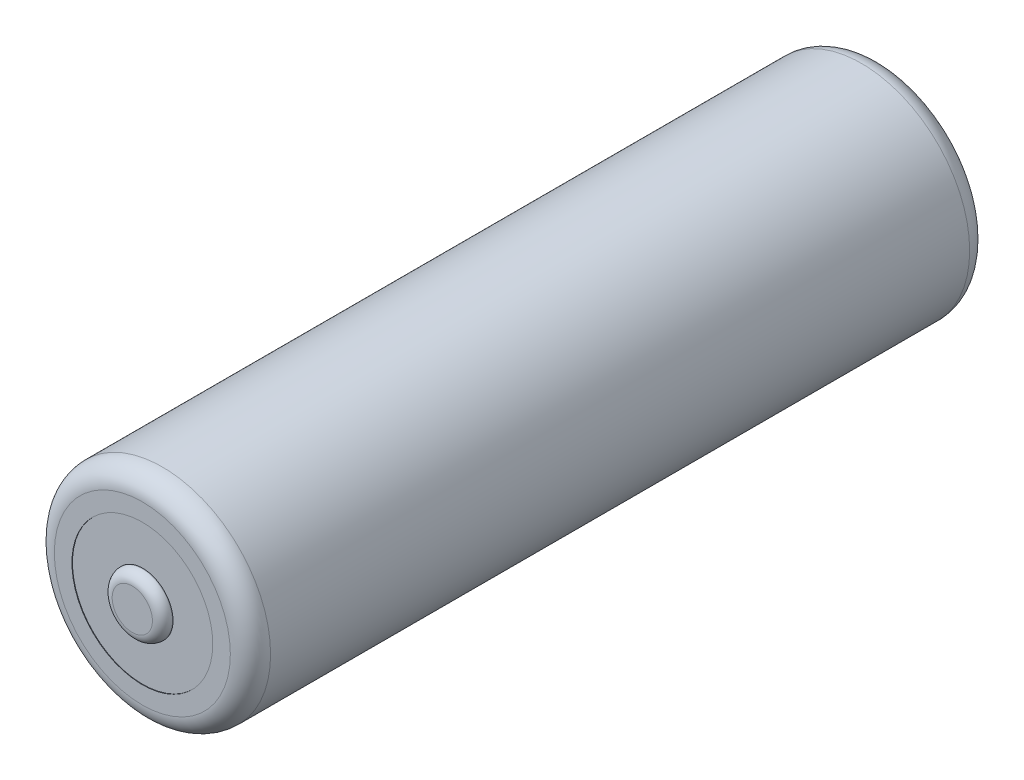
ISO-10303-21;
HEADER;
FILE_DESCRIPTION(('STEP AP214'),'2;1');
FILE_NAME('part.step','',(''),(''),'','','');
FILE_SCHEMA(('AUTOMOTIVE_DESIGN { 1 0 10303 214 1 1 1 1 }'));
ENDSEC;
DATA;
#1=APPLICATION_CONTEXT('core data for automotive mechanical design processes');
#2=APPLICATION_PROTOCOL_DEFINITION('international standard','automotive_design',2000,#1);
#3=PRODUCT_CONTEXT('',#1,'mechanical');
#4=PRODUCT('Part','Part','',(#3));
#5=PRODUCT_RELATED_PRODUCT_CATEGORY('part','',(#4));
#6=PRODUCT_DEFINITION_FORMATION('','',#4);
#7=PRODUCT_DEFINITION_CONTEXT('part definition',#1,'design');
#8=PRODUCT_DEFINITION('design','',#6,#7);
#9=PRODUCT_DEFINITION_SHAPE('','',#8);
#10=(LENGTH_UNIT() NAMED_UNIT(*) SI_UNIT(.MILLI.,.METRE.));
#11=(NAMED_UNIT(*) PLANE_ANGLE_UNIT() SI_UNIT($,.RADIAN.));
#12=(NAMED_UNIT(*) SI_UNIT($,.STERADIAN.) SOLID_ANGLE_UNIT());
#13=UNCERTAINTY_MEASURE_WITH_UNIT(LENGTH_MEASURE(1.E-05),#10,'distance_accuracy_value','');
#14=(GEOMETRIC_REPRESENTATION_CONTEXT(3) GLOBAL_UNCERTAINTY_ASSIGNED_CONTEXT((#13)) GLOBAL_UNIT_ASSIGNED_CONTEXT((#10,
#11,#12)) REPRESENTATION_CONTEXT('',''));
#15=CARTESIAN_POINT('',(0.,0.,0.));
#16=DIRECTION('',(0.,0.,1.));
#17=DIRECTION('',(1.,0.,0.));
#18=AXIS2_PLACEMENT_3D('',#15,#16,#17);
#19=CARTESIAN_POINT('',(0.,0.,73.5));
#20=DIRECTION('',(0.,0.,-1.));
#21=DIRECTION('',(-1.,0.,0.));
#22=AXIS2_PLACEMENT_3D('',#19,#20,#21);
#23=CYLINDRICAL_SURFACE('',#22,10.75);
#24=CARTESIAN_POINT('',(0.,0.,71.5));
#25=DIRECTION('',(0.,0.,1.));
#26=DIRECTION('',(1.,0.,0.));
#27=AXIS2_PLACEMENT_3D('',#24,#25,#26);
#28=CIRCLE('',#27,10.75);
#29=CARTESIAN_POINT('',(10.75,0.,71.5));
#30=VERTEX_POINT('',#29);
#31=EDGE_CURVE('E54',#30,#30,#28,.F.);
#32=ORIENTED_EDGE('',*,*,#31,.T.);
#33=EDGE_LOOP('',(#32));
#34=FACE_BOUND('',#33,.T.);
#35=CARTESIAN_POINT('',(0.,0.,2.));
#36=DIRECTION('',(0.,0.,1.));
#37=DIRECTION('',(1.,0.,0.));
#38=AXIS2_PLACEMENT_3D('',#35,#36,#37);
#39=CIRCLE('',#38,10.75);
#40=CARTESIAN_POINT('',(10.75,0.,2.));
#41=VERTEX_POINT('',#40);
#42=EDGE_CURVE('E59',#41,#41,#39,.T.);
#43=ORIENTED_EDGE('',*,*,#42,.T.);
#44=EDGE_LOOP('',(#43));
#45=FACE_BOUND('',#44,.T.);
#46=ADVANCED_FACE('F39',(#34,#45),#23,.T.);
#47=CARTESIAN_POINT('',(0.,0.,73.5));
#48=DIRECTION('',(0.,0.,1.));
#49=DIRECTION('',(1.,0.,0.));
#50=AXIS2_PLACEMENT_3D('',#47,#48,#49);
#51=PLANE('',#50);
#52=CARTESIAN_POINT('',(0.,0.,73.5));
#53=DIRECTION('',(0.,0.,1.));
#54=DIRECTION('',(1.,0.,0.));
#55=AXIS2_PLACEMENT_3D('',#52,#53,#54);
#56=CIRCLE('',#55,8.75);
#57=CARTESIAN_POINT('',(8.75,0.,73.5));
#58=VERTEX_POINT('',#57);
#59=EDGE_CURVE('E62',#58,#58,#56,.T.);
#60=ORIENTED_EDGE('',*,*,#59,.T.);
#61=EDGE_LOOP('',(#60));
#62=FACE_BOUND('',#61,.T.);
#63=CARTESIAN_POINT('',(0.,0.,73.5));
#64=DIRECTION('',(0.,0.,1.));
#65=DIRECTION('',(1.,0.,0.));
#66=AXIS2_PLACEMENT_3D('',#63,#64,#65);
#67=CIRCLE('',#66,7.);
#68=CARTESIAN_POINT('',(7.,0.,73.5));
#69=VERTEX_POINT('',#68);
#70=EDGE_CURVE('E66',#69,#69,#67,.T.);
#71=ORIENTED_EDGE('',*,*,#70,.F.);
#72=EDGE_LOOP('',(#71));
#73=FACE_BOUND('',#72,.T.);
#74=ADVANCED_FACE('F93',(#62,#73),#51,.T.);
#75=CARTESIAN_POINT('',(0.,0.,0.));
#76=DIRECTION('',(0.,0.,1.));
#77=DIRECTION('',(1.,0.,0.));
#78=AXIS2_PLACEMENT_3D('',#75,#76,#77);
#79=PLANE('',#78);
#80=CARTESIAN_POINT('',(0.,0.,0.));
#81=DIRECTION('',(0.,0.,1.));
#82=DIRECTION('',(1.,0.,0.));
#83=AXIS2_PLACEMENT_3D('',#80,#81,#82);
#84=CIRCLE('',#83,8.75);
#85=CARTESIAN_POINT('',(8.75,0.,0.));
#86=VERTEX_POINT('',#85);
#87=EDGE_CURVE('E50',#86,#86,#84,.F.);
#88=ORIENTED_EDGE('',*,*,#87,.T.);
#89=EDGE_LOOP('',(#88));
#90=FACE_BOUND('',#89,.T.);
#91=CARTESIAN_POINT('',(0.,0.,0.));
#92=DIRECTION('',(0.,0.,-1.));
#93=DIRECTION('',(-1.,0.,0.));
#94=AXIS2_PLACEMENT_3D('',#91,#92,#93);
#95=CIRCLE('',#94,7.5);
#96=CARTESIAN_POINT('',(-7.5,0.,0.));
#97=VERTEX_POINT('',#96);
#98=EDGE_CURVE('E75',#97,#97,#95,.T.);
#99=ORIENTED_EDGE('',*,*,#98,.F.);
#100=EDGE_LOOP('',(#99));
#101=FACE_BOUND('',#100,.T.);
#102=ADVANCED_FACE('F90',(#90,#101),#79,.F.);
#103=CARTESIAN_POINT('',(0.,0.,73.45));
#104=DIRECTION('',(0.,0.,1.));
#105=DIRECTION('',(1.,0.,0.));
#106=AXIS2_PLACEMENT_3D('',#103,#104,#105);
#107=CYLINDRICAL_SURFACE('',#106,7.);
#108=CARTESIAN_POINT('',(0.,0.,73.45));
#109=DIRECTION('',(0.,0.,1.));
#110=DIRECTION('',(1.,0.,0.));
#111=AXIS2_PLACEMENT_3D('',#108,#109,#110);
#112=CIRCLE('',#111,7.);
#113=CARTESIAN_POINT('',(7.,0.,73.45));
#114=VERTEX_POINT('',#113);
#115=EDGE_CURVE('E65',#114,#114,#112,.T.);
#116=ORIENTED_EDGE('',*,*,#115,.F.);
#117=EDGE_LOOP('',(#116));
#118=FACE_BOUND('',#117,.T.);
#119=ORIENTED_EDGE('',*,*,#70,.T.);
#120=EDGE_LOOP('',(#119));
#121=FACE_BOUND('',#120,.T.);
#122=ADVANCED_FACE('F92',(#118,#121),#107,.F.);
#123=CARTESIAN_POINT('',(0.,0.,73.45));
#124=DIRECTION('',(0.,0.,1.));
#125=DIRECTION('',(1.,0.,0.));
#126=AXIS2_PLACEMENT_3D('',#123,#124,#125);
#127=PLANE('',#126);
#128=CARTESIAN_POINT('',(0.,0.,73.45));
#129=DIRECTION('',(0.,0.,1.));
#130=DIRECTION('',(1.,0.,0.));
#131=AXIS2_PLACEMENT_3D('',#128,#129,#130);
#132=CIRCLE('',#131,3.);
#133=CARTESIAN_POINT('',(3.,0.,73.45));
#134=VERTEX_POINT('',#133);
#135=EDGE_CURVE('E69',#134,#134,#132,.T.);
#136=ORIENTED_EDGE('',*,*,#135,.F.);
#137=EDGE_LOOP('',(#136));
#138=FACE_BOUND('',#137,.T.);
#139=ORIENTED_EDGE('',*,*,#115,.T.);
#140=EDGE_LOOP('',(#139));
#141=FACE_BOUND('',#140,.T.);
#142=ADVANCED_FACE('F100',(#138,#141),#127,.T.);
#143=CARTESIAN_POINT('',(0.,0.,74.5));
#144=DIRECTION('',(0.,0.,1.));
#145=DIRECTION('',(1.,0.,0.));
#146=AXIS2_PLACEMENT_3D('',#143,#144,#145);
#147=PLANE('',#146);
#148=CARTESIAN_POINT('',(0.,0.,74.5));
#149=DIRECTION('',(0.,0.,1.));
#150=DIRECTION('',(1.,0.,0.));
#151=AXIS2_PLACEMENT_3D('',#148,#149,#150);
#152=CIRCLE('',#151,2.);
#153=CARTESIAN_POINT('',(2.,0.,74.5));
#154=VERTEX_POINT('',#153);
#155=EDGE_CURVE('E46',#154,#154,#152,.T.);
#156=ORIENTED_EDGE('',*,*,#155,.T.);
#157=EDGE_LOOP('',(#156));
#158=FACE_BOUND('',#157,.T.);
#159=ADVANCED_FACE('F138',(#158),#147,.T.);
#160=CARTESIAN_POINT('',(0.,0.,74.5));
#161=DIRECTION('',(0.,0.,-1.));
#162=DIRECTION('',(-1.,0.,0.));
#163=AXIS2_PLACEMENT_3D('',#160,#161,#162);
#164=CYLINDRICAL_SURFACE('',#163,3.);
#165=CARTESIAN_POINT('',(0.,0.,73.5));
#166=DIRECTION('',(0.,0.,1.));
#167=DIRECTION('',(1.,0.,0.));
#168=AXIS2_PLACEMENT_3D('',#165,#166,#167);
#169=CIRCLE('',#168,3.);
#170=CARTESIAN_POINT('',(3.,0.,73.5));
#171=VERTEX_POINT('',#170);
#172=EDGE_CURVE('E10',#171,#171,#169,.F.);
#173=ORIENTED_EDGE('',*,*,#172,.T.);
#174=EDGE_LOOP('',(#173));
#175=FACE_BOUND('',#174,.T.);
#176=ORIENTED_EDGE('',*,*,#135,.T.);
#177=EDGE_LOOP('',(#176));
#178=FACE_BOUND('',#177,.T.);
#179=ADVANCED_FACE('F86',(#175,#178),#164,.T.);
#180=CARTESIAN_POINT('',(0.,0.,0.05));
#181=DIRECTION('',(0.,0.,-1.));
#182=DIRECTION('',(-1.,0.,0.));
#183=AXIS2_PLACEMENT_3D('',#180,#181,#182);
#184=CYLINDRICAL_SURFACE('',#183,7.5);
#185=CARTESIAN_POINT('',(0.,0.,0.05));
#186=DIRECTION('',(0.,0.,-1.));
#187=DIRECTION('',(-1.,0.,0.));
#188=AXIS2_PLACEMENT_3D('',#185,#186,#187);
#189=CIRCLE('',#188,7.5);
#190=CARTESIAN_POINT('',(-7.5,0.,0.05));
#191=VERTEX_POINT('',#190);
#192=EDGE_CURVE('E74',#191,#191,#189,.T.);
#193=ORIENTED_EDGE('',*,*,#192,.F.);
#194=EDGE_LOOP('',(#193));
#195=FACE_BOUND('',#194,.T.);
#196=ORIENTED_EDGE('',*,*,#98,.T.);
#197=EDGE_LOOP('',(#196));
#198=FACE_BOUND('',#197,.T.);
#199=ADVANCED_FACE('F83',(#195,#198),#184,.F.);
#200=CARTESIAN_POINT('',(0.,0.,0.05));
#201=DIRECTION('',(0.,0.,-1.));
#202=DIRECTION('',(-1.,0.,0.));
#203=AXIS2_PLACEMENT_3D('',#200,#201,#202);
#204=PLANE('',#203);
#205=ORIENTED_EDGE('',*,*,#192,.T.);
#206=EDGE_LOOP('',(#205));
#207=FACE_BOUND('',#206,.T.);
#208=ADVANCED_FACE('F81',(#207),#204,.T.);
#209=CARTESIAN_POINT('',(0.,0.,71.5));
#210=DIRECTION('',(0.,0.,1.));
#211=DIRECTION('',(1.,0.,0.));
#212=AXIS2_PLACEMENT_3D('',#209,#210,#211);
#213=TOROIDAL_SURFACE('',#212,8.75,2.);
#214=ORIENTED_EDGE('',*,*,#31,.F.);
#215=EDGE_LOOP('',(#214));
#216=FACE_BOUND('',#215,.T.);
#217=ORIENTED_EDGE('',*,*,#59,.F.);
#218=EDGE_LOOP('',(#217));
#219=FACE_BOUND('',#218,.T.);
#220=ADVANCED_FACE('F112',(#216,#219),#213,.T.);
#221=CARTESIAN_POINT('',(0.,0.,2.));
#222=DIRECTION('',(0.,0.,1.));
#223=DIRECTION('',(1.,0.,0.));
#224=AXIS2_PLACEMENT_3D('',#221,#222,#223);
#225=TOROIDAL_SURFACE('',#224,8.75,2.);
#226=ORIENTED_EDGE('',*,*,#87,.F.);
#227=EDGE_LOOP('',(#226));
#228=FACE_BOUND('',#227,.T.);
#229=ORIENTED_EDGE('',*,*,#42,.F.);
#230=EDGE_LOOP('',(#229));
#231=FACE_BOUND('',#230,.T.);
#232=ADVANCED_FACE('F114',(#228,#231),#225,.T.);
#233=CARTESIAN_POINT('',(0.,0.,73.5));
#234=DIRECTION('',(0.,0.,1.));
#235=DIRECTION('',(1.,0.,0.));
#236=AXIS2_PLACEMENT_3D('',#233,#234,#235);
#237=TOROIDAL_SURFACE('',#236,2.,1.);
#238=ORIENTED_EDGE('',*,*,#172,.F.);
#239=EDGE_LOOP('',(#238));
#240=FACE_BOUND('',#239,.T.);
#241=ORIENTED_EDGE('',*,*,#155,.F.);
#242=EDGE_LOOP('',(#241));
#243=FACE_BOUND('',#242,.T.);
#244=ADVANCED_FACE('F41',(#240,#243),#237,.T.);
#245=CLOSED_SHELL('',(#46,#74,#102,#122,#142,#159,#179,#199,#208,#220,#232,#244));
#246=MANIFOLD_SOLID_BREP('B2',#245);
#247=ADVANCED_BREP_SHAPE_REPRESENTATION('',(#18,#246),#14);
#248=SHAPE_DEFINITION_REPRESENTATION(#9,#247);
ENDSEC;
END-ISO-10303-21;
